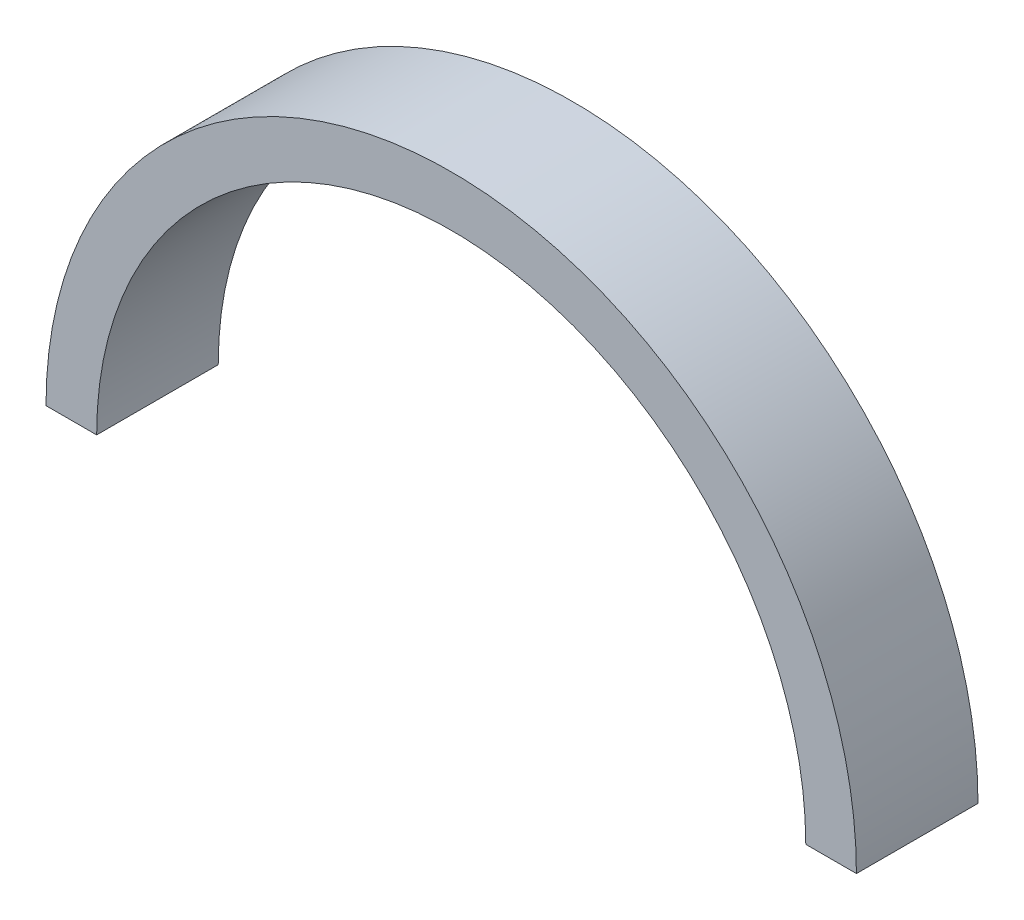
ISO-10303-21;
HEADER;
FILE_DESCRIPTION(('STEP AP214'),'2;1');
FILE_NAME('part.step','',(''),(''),'','','');
FILE_SCHEMA(('AUTOMOTIVE_DESIGN { 1 0 10303 214 1 1 1 1 }'));
ENDSEC;
DATA;
#1=APPLICATION_CONTEXT('core data for automotive mechanical design processes');
#2=APPLICATION_PROTOCOL_DEFINITION('international standard','automotive_design',2000,#1);
#3=PRODUCT_CONTEXT('',#1,'mechanical');
#4=PRODUCT('Part','Part','',(#3));
#5=PRODUCT_RELATED_PRODUCT_CATEGORY('part','',(#4));
#6=PRODUCT_DEFINITION_FORMATION('','',#4);
#7=PRODUCT_DEFINITION_CONTEXT('part definition',#1,'design');
#8=PRODUCT_DEFINITION('design','',#6,#7);
#9=PRODUCT_DEFINITION_SHAPE('','',#8);
#10=(LENGTH_UNIT() NAMED_UNIT(*) SI_UNIT(.MILLI.,.METRE.));
#11=(NAMED_UNIT(*) PLANE_ANGLE_UNIT() SI_UNIT($,.RADIAN.));
#12=(NAMED_UNIT(*) SI_UNIT($,.STERADIAN.) SOLID_ANGLE_UNIT());
#13=UNCERTAINTY_MEASURE_WITH_UNIT(LENGTH_MEASURE(1.E-05),#10,'distance_accuracy_value','');
#14=(GEOMETRIC_REPRESENTATION_CONTEXT(3) GLOBAL_UNCERTAINTY_ASSIGNED_CONTEXT((#13)) GLOBAL_UNIT_ASSIGNED_CONTEXT((#10,
#11,#12)) REPRESENTATION_CONTEXT('',''));
#15=CARTESIAN_POINT('',(0.,0.,0.));
#16=DIRECTION('',(0.,0.,1.));
#17=DIRECTION('',(1.,0.,0.));
#18=AXIS2_PLACEMENT_3D('',#15,#16,#17);
#19=CARTESIAN_POINT('',(0.,0.,24.));
#20=DIRECTION('',(0.,0.,-1.));
#21=DIRECTION('',(-1.,0.,0.));
#22=AXIS2_PLACEMENT_3D('',#19,#20,#21);
#23=CYLINDRICAL_SURFACE('',#22,70.);
#24=CARTESIAN_POINT('',(0.,0.,0.));
#25=DIRECTION('',(0.,0.,1.));
#26=DIRECTION('',(1.,0.,0.));
#27=AXIS2_PLACEMENT_3D('',#24,#25,#26);
#28=CIRCLE('',#27,70.);
#29=CARTESIAN_POINT('',(-70.,0.,0.));
#30=VERTEX_POINT('',#29);
#31=CARTESIAN_POINT('',(70.,0.,0.));
#32=VERTEX_POINT('',#31);
#33=EDGE_CURVE('E98',#30,#32,#28,.F.);
#34=ORIENTED_EDGE('',*,*,#33,.T.);
#35=DIRECTION('',(0.,0.,-1.));
#36=VECTOR('',#35,1.);
#37=CARTESIAN_POINT('',(70.,0.,24.));
#38=LINE('',#37,#36);
#39=CARTESIAN_POINT('',(70.,0.,24.));
#40=VERTEX_POINT('',#39);
#41=EDGE_CURVE('E11',#40,#32,#38,.T.);
#42=ORIENTED_EDGE('',*,*,#41,.F.);
#43=CARTESIAN_POINT('',(0.,0.,24.));
#44=DIRECTION('',(0.,0.,1.));
#45=DIRECTION('',(1.,0.,0.));
#46=AXIS2_PLACEMENT_3D('',#43,#44,#45);
#47=CIRCLE('',#46,70.);
#48=CARTESIAN_POINT('',(-70.,0.,24.));
#49=VERTEX_POINT('',#48);
#50=EDGE_CURVE('E75',#49,#40,#47,.F.);
#51=ORIENTED_EDGE('',*,*,#50,.F.);
#52=DIRECTION('',(0.,0.,-1.));
#53=VECTOR('',#52,1.);
#54=CARTESIAN_POINT('',(-70.,0.,24.));
#55=LINE('',#54,#53);
#56=EDGE_CURVE('E51',#49,#30,#55,.T.);
#57=ORIENTED_EDGE('',*,*,#56,.T.);
#58=EDGE_LOOP('',(#34,#42,#51,#57));
#59=FACE_BOUND('',#58,.T.);
#60=ADVANCED_FACE('F35',(#59),#23,.F.);
#61=CARTESIAN_POINT('',(80.,0.,24.));
#62=DIRECTION('',(0.,-1.,0.));
#63=DIRECTION('',(1.,0.,0.));
#64=AXIS2_PLACEMENT_3D('',#61,#62,#63);
#65=PLANE('',#64);
#66=DIRECTION('',(-1.,0.,0.));
#67=VECTOR('',#66,1.);
#68=CARTESIAN_POINT('',(80.,0.,0.));
#69=LINE('',#68,#67);
#70=CARTESIAN_POINT('',(80.,0.,0.));
#71=VERTEX_POINT('',#70);
#72=EDGE_CURVE('E84',#71,#32,#69,.T.);
#73=ORIENTED_EDGE('',*,*,#72,.F.);
#74=DIRECTION('',(0.,0.,-1.));
#75=VECTOR('',#74,1.);
#76=CARTESIAN_POINT('',(80.,0.,24.));
#77=LINE('',#76,#75);
#78=CARTESIAN_POINT('',(80.,0.,24.));
#79=VERTEX_POINT('',#78);
#80=EDGE_CURVE('E43',#79,#71,#77,.T.);
#81=ORIENTED_EDGE('',*,*,#80,.F.);
#82=DIRECTION('',(-1.,0.,0.));
#83=VECTOR('',#82,1.);
#84=CARTESIAN_POINT('',(80.,0.,24.));
#85=LINE('',#84,#83);
#86=EDGE_CURVE('E82',#79,#40,#85,.T.);
#87=ORIENTED_EDGE('',*,*,#86,.T.);
#88=ORIENTED_EDGE('',*,*,#41,.T.);
#89=EDGE_LOOP('',(#73,#81,#87,#88));
#90=FACE_BOUND('',#89,.T.);
#91=ADVANCED_FACE('F81',(#90),#65,.T.);
#92=CARTESIAN_POINT('',(0.,0.,24.));
#93=DIRECTION('',(0.,0.,-1.));
#94=DIRECTION('',(-1.,0.,0.));
#95=AXIS2_PLACEMENT_3D('',#92,#93,#94);
#96=CYLINDRICAL_SURFACE('',#95,80.);
#97=CARTESIAN_POINT('',(0.,0.,0.));
#98=DIRECTION('',(0.,0.,-1.));
#99=DIRECTION('',(-1.,0.,0.));
#100=AXIS2_PLACEMENT_3D('',#97,#98,#99);
#101=CIRCLE('',#100,80.);
#102=CARTESIAN_POINT('',(-80.,0.,0.));
#103=VERTEX_POINT('',#102);
#104=EDGE_CURVE('E101',#103,#71,#101,.T.);
#105=ORIENTED_EDGE('',*,*,#104,.F.);
#106=DIRECTION('',(0.,0.,-1.));
#107=VECTOR('',#106,1.);
#108=CARTESIAN_POINT('',(-80.,0.,24.));
#109=LINE('',#108,#107);
#110=CARTESIAN_POINT('',(-80.,0.,24.));
#111=VERTEX_POINT('',#110);
#112=EDGE_CURVE('E64',#111,#103,#109,.T.);
#113=ORIENTED_EDGE('',*,*,#112,.F.);
#114=CARTESIAN_POINT('',(0.,0.,24.));
#115=DIRECTION('',(0.,0.,-1.));
#116=DIRECTION('',(-1.,0.,0.));
#117=AXIS2_PLACEMENT_3D('',#114,#115,#116);
#118=CIRCLE('',#117,80.);
#119=EDGE_CURVE('E90',#111,#79,#118,.T.);
#120=ORIENTED_EDGE('',*,*,#119,.T.);
#121=ORIENTED_EDGE('',*,*,#80,.T.);
#122=EDGE_LOOP('',(#105,#113,#120,#121));
#123=FACE_BOUND('',#122,.T.);
#124=ADVANCED_FACE('F92',(#123),#96,.T.);
#125=CARTESIAN_POINT('',(-70.,0.,24.));
#126=DIRECTION('',(0.,-1.,0.));
#127=DIRECTION('',(1.,0.,0.));
#128=AXIS2_PLACEMENT_3D('',#125,#126,#127);
#129=PLANE('',#128);
#130=DIRECTION('',(-1.,0.,0.));
#131=VECTOR('',#130,1.);
#132=CARTESIAN_POINT('',(-70.,0.,0.));
#133=LINE('',#132,#131);
#134=EDGE_CURVE('E103',#30,#103,#133,.T.);
#135=ORIENTED_EDGE('',*,*,#134,.F.);
#136=ORIENTED_EDGE('',*,*,#56,.F.);
#137=DIRECTION('',(-1.,0.,0.));
#138=VECTOR('',#137,1.);
#139=CARTESIAN_POINT('',(-70.,0.,24.));
#140=LINE('',#139,#138);
#141=EDGE_CURVE('E93',#49,#111,#140,.T.);
#142=ORIENTED_EDGE('',*,*,#141,.T.);
#143=ORIENTED_EDGE('',*,*,#112,.T.);
#144=EDGE_LOOP('',(#135,#136,#142,#143));
#145=FACE_BOUND('',#144,.T.);
#146=ADVANCED_FACE('F109',(#145),#129,.T.);
#147=CARTESIAN_POINT('',(0.,0.,24.));
#148=DIRECTION('',(0.,0.,1.));
#149=DIRECTION('',(1.,0.,0.));
#150=AXIS2_PLACEMENT_3D('',#147,#148,#149);
#151=PLANE('',#150);
#152=ORIENTED_EDGE('',*,*,#50,.T.);
#153=ORIENTED_EDGE('',*,*,#86,.F.);
#154=ORIENTED_EDGE('',*,*,#119,.F.);
#155=ORIENTED_EDGE('',*,*,#141,.F.);
#156=EDGE_LOOP('',(#152,#153,#154,#155));
#157=FACE_BOUND('',#156,.T.);
#158=ADVANCED_FACE('F89',(#157),#151,.T.);
#159=CARTESIAN_POINT('',(0.,0.,0.));
#160=DIRECTION('',(0.,0.,1.));
#161=DIRECTION('',(1.,0.,0.));
#162=AXIS2_PLACEMENT_3D('',#159,#160,#161);
#163=PLANE('',#162);
#164=ORIENTED_EDGE('',*,*,#33,.F.);
#165=ORIENTED_EDGE('',*,*,#134,.T.);
#166=ORIENTED_EDGE('',*,*,#104,.T.);
#167=ORIENTED_EDGE('',*,*,#72,.T.);
#168=EDGE_LOOP('',(#164,#165,#166,#167));
#169=FACE_BOUND('',#168,.T.);
#170=ADVANCED_FACE('F108',(#169),#163,.F.);
#171=CLOSED_SHELL('',(#60,#91,#124,#146,#158,#170));
#172=MANIFOLD_SOLID_BREP('B2',#171);
#173=ADVANCED_BREP_SHAPE_REPRESENTATION('',(#18,#172),#14);
#174=SHAPE_DEFINITION_REPRESENTATION(#9,#173);
ENDSEC;
END-ISO-10303-21;
